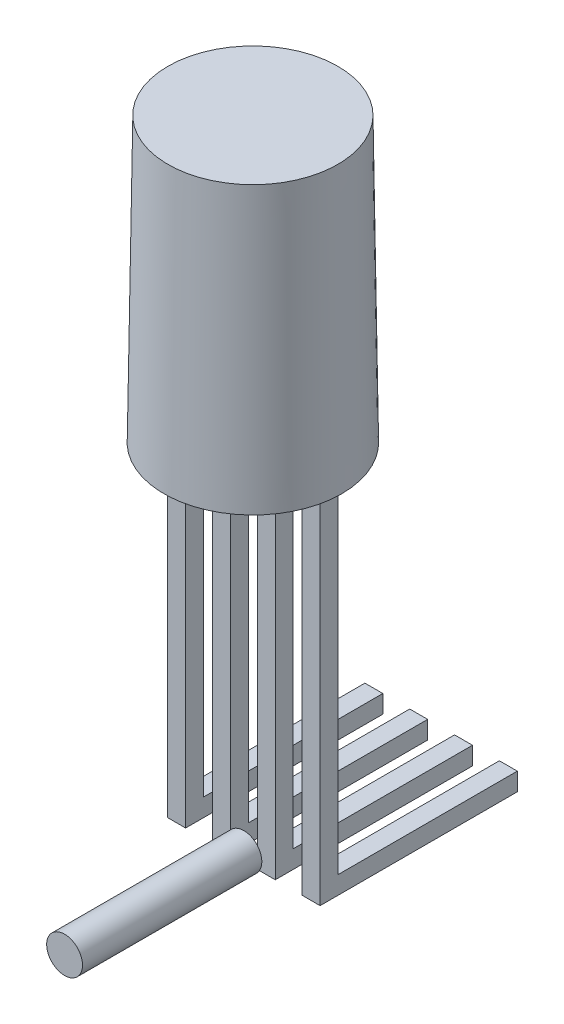
ISO-10303-21;
HEADER;
FILE_DESCRIPTION(('STEP AP214'),'2;1');
FILE_NAME('part.step','',(''),(''),'','','');
FILE_SCHEMA(('AUTOMOTIVE_DESIGN { 1 0 10303 214 1 1 1 1 }'));
ENDSEC;
DATA;
#1=APPLICATION_CONTEXT('core data for automotive mechanical design processes');
#2=APPLICATION_PROTOCOL_DEFINITION('international standard','automotive_design',2000,#1);
#3=PRODUCT_CONTEXT('',#1,'mechanical');
#4=PRODUCT('Part','Part','',(#3));
#5=PRODUCT_RELATED_PRODUCT_CATEGORY('part','',(#4));
#6=PRODUCT_DEFINITION_FORMATION('','',#4);
#7=PRODUCT_DEFINITION_CONTEXT('part definition',#1,'design');
#8=PRODUCT_DEFINITION('design','',#6,#7);
#9=PRODUCT_DEFINITION_SHAPE('','',#8);
#10=(LENGTH_UNIT() NAMED_UNIT(*) SI_UNIT(.MILLI.,.METRE.));
#11=(NAMED_UNIT(*) PLANE_ANGLE_UNIT() SI_UNIT($,.RADIAN.));
#12=(NAMED_UNIT(*) SI_UNIT($,.STERADIAN.) SOLID_ANGLE_UNIT());
#13=UNCERTAINTY_MEASURE_WITH_UNIT(LENGTH_MEASURE(1.E-05),#10,'distance_accuracy_value','');
#14=(GEOMETRIC_REPRESENTATION_CONTEXT(3) GLOBAL_UNCERTAINTY_ASSIGNED_CONTEXT((#13)) GLOBAL_UNIT_ASSIGNED_CONTEXT((#10,
#11,#12)) REPRESENTATION_CONTEXT('',''));
#15=CARTESIAN_POINT('',(0.,0.,0.));
#16=DIRECTION('',(0.,0.,1.));
#17=DIRECTION('',(1.,0.,0.));
#18=AXIS2_PLACEMENT_3D('',#15,#16,#17);
#19=CARTESIAN_POINT('',(0.,0.,0.));
#20=DIRECTION('',(0.,1.,0.));
#21=DIRECTION('',(-1.,0.,0.));
#22=AXIS2_PLACEMENT_3D('',#19,#20,#21);
#23=PLANE('',#22);
#24=DIRECTION('',(-1.,0.,0.));
#25=VECTOR('',#24,1.);
#26=CARTESIAN_POINT('',(0.375,0.,0.25));
#27=LINE('',#26,#25);
#28=CARTESIAN_POINT('',(0.875,0.,0.25));
#29=VERTEX_POINT('',#28);
#30=CARTESIAN_POINT('',(0.375,0.,0.25));
#31=VERTEX_POINT('',#30);
#32=EDGE_CURVE('E237',#29,#31,#27,.T.);
#33=ORIENTED_EDGE('',*,*,#32,.F.);
#34=DIRECTION('',(0.,0.,1.));
#35=VECTOR('',#34,1.);
#36=CARTESIAN_POINT('',(0.875,0.,-0.25));
#37=LINE('',#36,#35);
#38=CARTESIAN_POINT('',(0.875,0.,-0.25));
#39=VERTEX_POINT('',#38);
#40=EDGE_CURVE('E408',#39,#29,#37,.T.);
#41=ORIENTED_EDGE('',*,*,#40,.F.);
#42=DIRECTION('',(1.,0.,0.));
#43=VECTOR('',#42,1.);
#44=CARTESIAN_POINT('',(0.375,0.,-0.25));
#45=LINE('',#44,#43);
#46=CARTESIAN_POINT('',(0.375,0.,-0.25));
#47=VERTEX_POINT('',#46);
#48=EDGE_CURVE('E404',#47,#39,#45,.T.);
#49=ORIENTED_EDGE('',*,*,#48,.F.);
#50=DIRECTION('',(0.,0.,-1.));
#51=VECTOR('',#50,1.);
#52=CARTESIAN_POINT('',(0.375,0.,-0.25));
#53=LINE('',#52,#51);
#54=EDGE_CURVE('E401',#31,#47,#53,.T.);
#55=ORIENTED_EDGE('',*,*,#54,.F.);
#56=EDGE_LOOP('',(#33,#41,#49,#55));
#57=FACE_BOUND('',#56,.T.);
#58=DIRECTION('',(0.,0.,1.));
#59=VECTOR('',#58,1.);
#60=CARTESIAN_POINT('',(-1.625,0.,-0.25));
#61=LINE('',#60,#59);
#62=CARTESIAN_POINT('',(-1.625,0.,-0.25));
#63=VERTEX_POINT('',#62);
#64=CARTESIAN_POINT('',(-1.625,0.,0.25));
#65=VERTEX_POINT('',#64);
#66=EDGE_CURVE('E293',#63,#65,#61,.T.);
#67=ORIENTED_EDGE('',*,*,#66,.F.);
#68=DIRECTION('',(1.,0.,0.));
#69=VECTOR('',#68,1.);
#70=CARTESIAN_POINT('',(-2.125,0.,-0.25));
#71=LINE('',#70,#69);
#72=CARTESIAN_POINT('',(-2.125,0.,-0.25));
#73=VERTEX_POINT('',#72);
#74=EDGE_CURVE('E299',#73,#63,#71,.T.);
#75=ORIENTED_EDGE('',*,*,#74,.F.);
#76=DIRECTION('',(0.,0.,-1.));
#77=VECTOR('',#76,1.);
#78=CARTESIAN_POINT('',(-2.125,0.,-0.25));
#79=LINE('',#78,#77);
#80=CARTESIAN_POINT('',(-2.125,0.,0.25));
#81=VERTEX_POINT('',#80);
#82=EDGE_CURVE('E313',#81,#73,#79,.T.);
#83=ORIENTED_EDGE('',*,*,#82,.F.);
#84=DIRECTION('',(-1.,0.,0.));
#85=VECTOR('',#84,1.);
#86=CARTESIAN_POINT('',(-2.125,0.,0.25));
#87=LINE('',#86,#85);
#88=EDGE_CURVE('E309',#65,#81,#87,.T.);
#89=ORIENTED_EDGE('',*,*,#88,.F.);
#90=EDGE_LOOP('',(#67,#75,#83,#89));
#91=FACE_BOUND('',#90,.T.);
#92=CARTESIAN_POINT('',(0.,0.,0.));
#93=DIRECTION('',(0.,1.,0.));
#94=DIRECTION('',(-1.,0.,0.));
#95=AXIS2_PLACEMENT_3D('',#92,#93,#94);
#96=CIRCLE('',#95,2.48);
#97=CARTESIAN_POINT('',(-2.48,0.,0.));
#98=VERTEX_POINT('',#97);
#99=EDGE_CURVE('E11',#98,#98,#96,.T.);
#100=ORIENTED_EDGE('',*,*,#99,.F.);
#101=EDGE_LOOP('',(#100));
#102=FACE_BOUND('',#101,.T.);
#103=DIRECTION('',(-1.,0.,0.));
#104=VECTOR('',#103,1.);
#105=CARTESIAN_POINT('',(-0.875,0.,0.25));
#106=LINE('',#105,#104);
#107=CARTESIAN_POINT('',(-0.375,0.,0.25));
#108=VERTEX_POINT('',#107);
#109=CARTESIAN_POINT('',(-0.875,0.,0.25));
#110=VERTEX_POINT('',#109);
#111=EDGE_CURVE('E249',#108,#110,#106,.T.);
#112=ORIENTED_EDGE('',*,*,#111,.F.);
#113=DIRECTION('',(0.,0.,1.));
#114=VECTOR('',#113,1.);
#115=CARTESIAN_POINT('',(-0.375,0.,-0.25));
#116=LINE('',#115,#114);
#117=CARTESIAN_POINT('',(-0.375,0.,-0.25));
#118=VERTEX_POINT('',#117);
#119=EDGE_CURVE('E277',#118,#108,#116,.T.);
#120=ORIENTED_EDGE('',*,*,#119,.F.);
#121=DIRECTION('',(1.,0.,0.));
#122=VECTOR('',#121,1.);
#123=CARTESIAN_POINT('',(-0.875,0.,-0.25));
#124=LINE('',#123,#122);
#125=CARTESIAN_POINT('',(-0.875,0.,-0.25));
#126=VERTEX_POINT('',#125);
#127=EDGE_CURVE('E273',#126,#118,#124,.T.);
#128=ORIENTED_EDGE('',*,*,#127,.F.);
#129=DIRECTION('',(0.,0.,-1.));
#130=VECTOR('',#129,1.);
#131=CARTESIAN_POINT('',(-0.875,0.,-0.25));
#132=LINE('',#131,#130);
#133=EDGE_CURVE('E252',#110,#126,#132,.T.);
#134=ORIENTED_EDGE('',*,*,#133,.F.);
#135=EDGE_LOOP('',(#112,#120,#128,#134));
#136=FACE_BOUND('',#135,.T.);
#137=DIRECTION('',(-1.,0.,0.));
#138=VECTOR('',#137,1.);
#139=CARTESIAN_POINT('',(1.625,0.,0.25));
#140=LINE('',#139,#138);
#141=CARTESIAN_POINT('',(2.125,0.,0.25));
#142=VERTEX_POINT('',#141);
#143=CARTESIAN_POINT('',(1.625,0.,0.25));
#144=VERTEX_POINT('',#143);
#145=EDGE_CURVE('E350',#142,#144,#140,.T.);
#146=ORIENTED_EDGE('',*,*,#145,.F.);
#147=DIRECTION('',(0.,0.,1.));
#148=VECTOR('',#147,1.);
#149=CARTESIAN_POINT('',(2.125,0.,-0.25));
#150=LINE('',#149,#148);
#151=CARTESIAN_POINT('',(2.125,0.,-0.25));
#152=VERTEX_POINT('',#151);
#153=EDGE_CURVE('E352',#152,#142,#150,.T.);
#154=ORIENTED_EDGE('',*,*,#153,.F.);
#155=DIRECTION('',(1.,0.,0.));
#156=VECTOR('',#155,1.);
#157=CARTESIAN_POINT('',(1.625,0.,-0.25));
#158=LINE('',#157,#156);
#159=CARTESIAN_POINT('',(1.625,0.,-0.25));
#160=VERTEX_POINT('',#159);
#161=EDGE_CURVE('E369',#160,#152,#158,.T.);
#162=ORIENTED_EDGE('',*,*,#161,.F.);
#163=DIRECTION('',(0.,0.,-1.));
#164=VECTOR('',#163,1.);
#165=CARTESIAN_POINT('',(1.625,0.,-0.25));
#166=LINE('',#165,#164);
#167=EDGE_CURVE('E62',#144,#160,#166,.T.);
#168=ORIENTED_EDGE('',*,*,#167,.F.);
#169=EDGE_LOOP('',(#146,#154,#162,#168));
#170=FACE_BOUND('',#169,.T.);
#171=ADVANCED_FACE('F39',(#57,#91,#102,#136,#170),#23,.F.);
#172=CARTESIAN_POINT('',(0.,0.,0.));
#173=DIRECTION('',(0.,-1.,0.));
#174=DIRECTION('',(1.,0.,0.));
#175=AXIS2_PLACEMENT_3D('',#172,#173,#174);
#176=CONICAL_SURFACE('',#175,2.48,0.0139231508763745);
#177=CARTESIAN_POINT('',(0.,7.9,0.));
#178=DIRECTION('',(0.,1.,0.));
#179=DIRECTION('',(-1.,0.,0.));
#180=AXIS2_PLACEMENT_3D('',#177,#178,#179);
#181=CIRCLE('',#180,2.37);
#182=CARTESIAN_POINT('',(-2.37,7.9,0.));
#183=VERTEX_POINT('',#182);
#184=EDGE_CURVE('E47',#183,#183,#181,.T.);
#185=ORIENTED_EDGE('',*,*,#184,.F.);
#186=EDGE_LOOP('',(#185));
#187=FACE_BOUND('',#186,.T.);
#188=ORIENTED_EDGE('',*,*,#99,.T.);
#189=EDGE_LOOP('',(#188));
#190=FACE_BOUND('',#189,.T.);
#191=ADVANCED_FACE('F338',(#187,#190),#176,.T.);
#192=CARTESIAN_POINT('',(2.37,7.9,0.));
#193=DIRECTION('',(0.,-1.,0.));
#194=DIRECTION('',(1.,0.,0.));
#195=AXIS2_PLACEMENT_3D('',#192,#193,#194);
#196=PLANE('',#195);
#197=ORIENTED_EDGE('',*,*,#184,.T.);
#198=EDGE_LOOP('',(#197));
#199=FACE_BOUND('',#198,.T.);
#200=ADVANCED_FACE('F336',(#199),#196,.F.);
#201=CARTESIAN_POINT('',(-1.625,-10.,-0.25));
#202=DIRECTION('',(-1.,0.,0.));
#203=DIRECTION('',(0.,-1.,0.));
#204=AXIS2_PLACEMENT_3D('',#201,#202,#203);
#205=PLANE('',#204);
#206=ORIENTED_EDGE('',*,*,#66,.T.);
#207=DIRECTION('',(0.,1.,0.));
#208=VECTOR('',#207,1.);
#209=CARTESIAN_POINT('',(-1.625,-10.,0.25));
#210=LINE('',#209,#208);
#211=CARTESIAN_POINT('',(-1.625,-10.,0.25));
#212=VERTEX_POINT('',#211);
#213=EDGE_CURVE('E329',#212,#65,#210,.T.);
#214=ORIENTED_EDGE('',*,*,#213,.F.);
#215=DIRECTION('',(0.,0.,1.));
#216=VECTOR('',#215,1.);
#217=CARTESIAN_POINT('',(-1.625,-10.,-0.25));
#218=LINE('',#217,#216);
#219=CARTESIAN_POINT('',(-1.625,-10.,-5.25));
#220=VERTEX_POINT('',#219);
#221=EDGE_CURVE('E294',#220,#212,#218,.T.);
#222=ORIENTED_EDGE('',*,*,#221,.F.);
#223=DIRECTION('',(0.,1.,0.));
#224=VECTOR('',#223,1.);
#225=CARTESIAN_POINT('',(-1.625,-10.,-5.25));
#226=LINE('',#225,#224);
#227=CARTESIAN_POINT('',(-1.625,-9.5,-5.25));
#228=VERTEX_POINT('',#227);
#229=EDGE_CURVE('E498',#220,#228,#226,.T.);
#230=ORIENTED_EDGE('',*,*,#229,.T.);
#231=DIRECTION('',(0.,0.,1.));
#232=VECTOR('',#231,1.);
#233=CARTESIAN_POINT('',(-1.625,-9.5,-5.25));
#234=LINE('',#233,#232);
#235=CARTESIAN_POINT('',(-1.625,-9.5,-0.25));
#236=VERTEX_POINT('',#235);
#237=EDGE_CURVE('E506',#228,#236,#234,.T.);
#238=ORIENTED_EDGE('',*,*,#237,.T.);
#239=DIRECTION('',(0.,1.,0.));
#240=VECTOR('',#239,1.);
#241=CARTESIAN_POINT('',(-1.625,-10.,-0.25));
#242=LINE('',#241,#240);
#243=EDGE_CURVE('E305',#236,#63,#242,.T.);
#244=ORIENTED_EDGE('',*,*,#243,.T.);
#245=EDGE_LOOP('',(#206,#214,#222,#230,#238,#244));
#246=FACE_BOUND('',#245,.T.);
#247=ADVANCED_FACE('F645',(#246),#205,.F.);
#248=CARTESIAN_POINT('',(-2.125,-10.,0.25));
#249=DIRECTION('',(0.,0.,-1.));
#250=DIRECTION('',(-1.,0.,0.));
#251=AXIS2_PLACEMENT_3D('',#248,#249,#250);
#252=PLANE('',#251);
#253=ORIENTED_EDGE('',*,*,#88,.T.);
#254=DIRECTION('',(0.,1.,0.));
#255=VECTOR('',#254,1.);
#256=CARTESIAN_POINT('',(-2.125,-10.,0.25));
#257=LINE('',#256,#255);
#258=CARTESIAN_POINT('',(-2.125,-10.,0.25));
#259=VERTEX_POINT('',#258);
#260=EDGE_CURVE('E325',#259,#81,#257,.T.);
#261=ORIENTED_EDGE('',*,*,#260,.F.);
#262=DIRECTION('',(-1.,0.,0.));
#263=VECTOR('',#262,1.);
#264=CARTESIAN_POINT('',(-2.125,-10.,0.25));
#265=LINE('',#264,#263);
#266=EDGE_CURVE('E298',#212,#259,#265,.T.);
#267=ORIENTED_EDGE('',*,*,#266,.F.);
#268=ORIENTED_EDGE('',*,*,#213,.T.);
#269=EDGE_LOOP('',(#253,#261,#267,#268));
#270=FACE_BOUND('',#269,.T.);
#271=ADVANCED_FACE('F641',(#270),#252,.F.);
#272=CARTESIAN_POINT('',(-2.125,-10.,-0.25));
#273=DIRECTION('',(1.,0.,0.));
#274=DIRECTION('',(0.,1.,0.));
#275=AXIS2_PLACEMENT_3D('',#272,#273,#274);
#276=PLANE('',#275);
#277=ORIENTED_EDGE('',*,*,#82,.T.);
#278=DIRECTION('',(0.,1.,0.));
#279=VECTOR('',#278,1.);
#280=CARTESIAN_POINT('',(-2.125,-10.,-0.25));
#281=LINE('',#280,#279);
#282=CARTESIAN_POINT('',(-2.125,-9.5,-0.25));
#283=VERTEX_POINT('',#282);
#284=EDGE_CURVE('E322',#283,#73,#281,.T.);
#285=ORIENTED_EDGE('',*,*,#284,.F.);
#286=DIRECTION('',(0.,0.,1.));
#287=VECTOR('',#286,1.);
#288=CARTESIAN_POINT('',(-2.125,-9.5,-5.25));
#289=LINE('',#288,#287);
#290=CARTESIAN_POINT('',(-2.125,-9.5,-5.25));
#291=VERTEX_POINT('',#290);
#292=EDGE_CURVE('E358',#291,#283,#289,.T.);
#293=ORIENTED_EDGE('',*,*,#292,.F.);
#294=DIRECTION('',(0.,-1.,0.));
#295=VECTOR('',#294,1.);
#296=CARTESIAN_POINT('',(-2.125,-10.,-5.25));
#297=LINE('',#296,#295);
#298=CARTESIAN_POINT('',(-2.125,-10.,-5.25));
#299=VERTEX_POINT('',#298);
#300=EDGE_CURVE('E490',#291,#299,#297,.T.);
#301=ORIENTED_EDGE('',*,*,#300,.T.);
#302=DIRECTION('',(0.,0.,-1.));
#303=VECTOR('',#302,1.);
#304=CARTESIAN_POINT('',(-2.125,-10.,-0.25));
#305=LINE('',#304,#303);
#306=EDGE_CURVE('E302',#259,#299,#305,.T.);
#307=ORIENTED_EDGE('',*,*,#306,.F.);
#308=ORIENTED_EDGE('',*,*,#260,.T.);
#309=EDGE_LOOP('',(#277,#285,#293,#301,#307,#308));
#310=FACE_BOUND('',#309,.T.);
#311=ADVANCED_FACE('F637',(#310),#276,.F.);
#312=CARTESIAN_POINT('',(-2.125,-10.,-0.25));
#313=DIRECTION('',(0.,0.,1.));
#314=DIRECTION('',(1.,0.,0.));
#315=AXIS2_PLACEMENT_3D('',#312,#313,#314);
#316=PLANE('',#315);
#317=ORIENTED_EDGE('',*,*,#243,.F.);
#318=DIRECTION('',(-1.,0.,0.));
#319=VECTOR('',#318,1.);
#320=CARTESIAN_POINT('',(-2.125,-9.5,-0.25));
#321=LINE('',#320,#319);
#322=EDGE_CURVE('E487',#236,#283,#321,.T.);
#323=ORIENTED_EDGE('',*,*,#322,.T.);
#324=ORIENTED_EDGE('',*,*,#284,.T.);
#325=ORIENTED_EDGE('',*,*,#74,.T.);
#326=EDGE_LOOP('',(#317,#323,#324,#325));
#327=FACE_BOUND('',#326,.T.);
#328=ADVANCED_FACE('F633',(#327),#316,.F.);
#329=CARTESIAN_POINT('',(0.,-10.,0.));
#330=DIRECTION('',(0.,1.,0.));
#331=DIRECTION('',(-1.,0.,0.));
#332=AXIS2_PLACEMENT_3D('',#329,#330,#331);
#333=PLANE('',#332);
#334=ORIENTED_EDGE('',*,*,#221,.T.);
#335=ORIENTED_EDGE('',*,*,#266,.T.);
#336=ORIENTED_EDGE('',*,*,#306,.T.);
#337=DIRECTION('',(1.,0.,0.));
#338=VECTOR('',#337,1.);
#339=CARTESIAN_POINT('',(-2.125,-10.,-5.25));
#340=LINE('',#339,#338);
#341=EDGE_CURVE('E494',#299,#220,#340,.T.);
#342=ORIENTED_EDGE('',*,*,#341,.T.);
#343=EDGE_LOOP('',(#334,#335,#336,#342));
#344=FACE_BOUND('',#343,.T.);
#345=ADVANCED_FACE('F629',(#344),#333,.F.);
#346=CARTESIAN_POINT('',(-0.875,-10.,0.25));
#347=DIRECTION('',(0.,0.,-1.));
#348=DIRECTION('',(-1.,0.,0.));
#349=AXIS2_PLACEMENT_3D('',#346,#347,#348);
#350=PLANE('',#349);
#351=CARTESIAN_POINT('',(0.,-9.75,0.25));
#352=DIRECTION('',(0.,0.,1.));
#353=DIRECTION('',(1.,0.,0.));
#354=AXIS2_PLACEMENT_3D('',#351,#352,#353);
#355=CIRCLE('',#354,0.5);
#356=CARTESIAN_POINT('',(-0.375,-9.41928108611693,0.25));
#357=VERTEX_POINT('',#356);
#358=CARTESIAN_POINT('',(-0.433012701892219,-10.,0.25));
#359=VERTEX_POINT('',#358);
#360=EDGE_CURVE('E54',#357,#359,#355,.T.);
#361=ORIENTED_EDGE('',*,*,#360,.F.);
#362=DIRECTION('',(0.,1.,0.));
#363=VECTOR('',#362,1.);
#364=CARTESIAN_POINT('',(-0.375,-10.,0.25));
#365=LINE('',#364,#363);
#366=EDGE_CURVE('E268',#357,#108,#365,.T.);
#367=ORIENTED_EDGE('',*,*,#366,.T.);
#368=ORIENTED_EDGE('',*,*,#111,.T.);
#369=DIRECTION('',(0.,1.,0.));
#370=VECTOR('',#369,1.);
#371=CARTESIAN_POINT('',(-0.875,-10.,0.25));
#372=LINE('',#371,#370);
#373=CARTESIAN_POINT('',(-0.875,-10.,0.25));
#374=VERTEX_POINT('',#373);
#375=EDGE_CURVE('E289',#374,#110,#372,.T.);
#376=ORIENTED_EDGE('',*,*,#375,.F.);
#377=DIRECTION('',(-1.,0.,0.));
#378=VECTOR('',#377,1.);
#379=CARTESIAN_POINT('',(-0.875,-10.,0.25));
#380=LINE('',#379,#378);
#381=EDGE_CURVE('E262',#359,#374,#380,.T.);
#382=ORIENTED_EDGE('',*,*,#381,.F.);
#383=EDGE_LOOP('',(#361,#367,#368,#376,#382));
#384=FACE_BOUND('',#383,.T.);
#385=ADVANCED_FACE('F625',(#384),#350,.F.);
#386=CARTESIAN_POINT('',(-0.875,-10.,-0.25));
#387=DIRECTION('',(1.,0.,0.));
#388=DIRECTION('',(0.,0.,-1.));
#389=AXIS2_PLACEMENT_3D('',#386,#387,#388);
#390=PLANE('',#389);
#391=ORIENTED_EDGE('',*,*,#133,.T.);
#392=DIRECTION('',(0.,1.,0.));
#393=VECTOR('',#392,1.);
#394=CARTESIAN_POINT('',(-0.875,-10.,-0.25));
#395=LINE('',#394,#393);
#396=CARTESIAN_POINT('',(-0.875,-9.5,-0.25));
#397=VERTEX_POINT('',#396);
#398=EDGE_CURVE('E286',#397,#126,#395,.T.);
#399=ORIENTED_EDGE('',*,*,#398,.F.);
#400=DIRECTION('',(0.,0.,1.));
#401=VECTOR('',#400,1.);
#402=CARTESIAN_POINT('',(-0.875,-9.5,-5.25));
#403=LINE('',#402,#401);
#404=CARTESIAN_POINT('',(-0.875,-9.5,-5.25));
#405=VERTEX_POINT('',#404);
#406=EDGE_CURVE('E484',#405,#397,#403,.T.);
#407=ORIENTED_EDGE('',*,*,#406,.F.);
#408=DIRECTION('',(0.,-1.,0.));
#409=VECTOR('',#408,1.);
#410=CARTESIAN_POINT('',(-0.875,-10.,-5.25));
#411=LINE('',#410,#409);
#412=CARTESIAN_POINT('',(-0.875,-10.,-5.25));
#413=VERTEX_POINT('',#412);
#414=EDGE_CURVE('E476',#405,#413,#411,.T.);
#415=ORIENTED_EDGE('',*,*,#414,.T.);
#416=DIRECTION('',(0.,0.,-1.));
#417=VECTOR('',#416,1.);
#418=CARTESIAN_POINT('',(-0.875,-10.,-0.25));
#419=LINE('',#418,#417);
#420=EDGE_CURVE('E261',#374,#413,#419,.T.);
#421=ORIENTED_EDGE('',*,*,#420,.F.);
#422=ORIENTED_EDGE('',*,*,#375,.T.);
#423=EDGE_LOOP('',(#391,#399,#407,#415,#421,#422));
#424=FACE_BOUND('',#423,.T.);
#425=ADVANCED_FACE('F621',(#424),#390,.F.);
#426=CARTESIAN_POINT('',(-0.875,-10.,-0.25));
#427=DIRECTION('',(0.,0.,1.));
#428=DIRECTION('',(1.,0.,0.));
#429=AXIS2_PLACEMENT_3D('',#426,#427,#428);
#430=PLANE('',#429);
#431=DIRECTION('',(0.,1.,0.));
#432=VECTOR('',#431,1.);
#433=CARTESIAN_POINT('',(-0.375,-10.,-0.25));
#434=LINE('',#433,#432);
#435=CARTESIAN_POINT('',(-0.375,-9.5,-0.25));
#436=VERTEX_POINT('',#435);
#437=EDGE_CURVE('E283',#436,#118,#434,.T.);
#438=ORIENTED_EDGE('',*,*,#437,.F.);
#439=DIRECTION('',(-1.,0.,0.));
#440=VECTOR('',#439,1.);
#441=CARTESIAN_POINT('',(-0.875,-9.5,-0.25));
#442=LINE('',#441,#440);
#443=EDGE_CURVE('E461',#436,#397,#442,.T.);
#444=ORIENTED_EDGE('',*,*,#443,.T.);
#445=ORIENTED_EDGE('',*,*,#398,.T.);
#446=ORIENTED_EDGE('',*,*,#127,.T.);
#447=EDGE_LOOP('',(#438,#444,#445,#446));
#448=FACE_BOUND('',#447,.T.);
#449=ADVANCED_FACE('F617',(#448),#430,.F.);
#450=CARTESIAN_POINT('',(-0.375,-10.,-0.25));
#451=DIRECTION('',(-1.,0.,0.));
#452=DIRECTION('',(0.,0.,1.));
#453=AXIS2_PLACEMENT_3D('',#450,#451,#452);
#454=PLANE('',#453);
#455=ORIENTED_EDGE('',*,*,#119,.T.);
#456=ORIENTED_EDGE('',*,*,#366,.F.);
#457=CARTESIAN_POINT('',(-0.375,-10.,0.25));
#458=VERTEX_POINT('',#457);
#459=EDGE_CURVE('E230',#458,#357,#365,.T.);
#460=ORIENTED_EDGE('',*,*,#459,.F.);
#461=DIRECTION('',(0.,0.,1.));
#462=VECTOR('',#461,1.);
#463=CARTESIAN_POINT('',(-0.375,-10.,-0.25));
#464=LINE('',#463,#462);
#465=CARTESIAN_POINT('',(-0.375,-10.,-5.25));
#466=VERTEX_POINT('',#465);
#467=EDGE_CURVE('E265',#466,#458,#464,.T.);
#468=ORIENTED_EDGE('',*,*,#467,.F.);
#469=DIRECTION('',(0.,1.,0.));
#470=VECTOR('',#469,1.);
#471=CARTESIAN_POINT('',(-0.375,-10.,-5.25));
#472=LINE('',#471,#470);
#473=CARTESIAN_POINT('',(-0.375,-9.5,-5.25));
#474=VERTEX_POINT('',#473);
#475=EDGE_CURVE('E468',#466,#474,#472,.T.);
#476=ORIENTED_EDGE('',*,*,#475,.T.);
#477=DIRECTION('',(0.,0.,1.));
#478=VECTOR('',#477,1.);
#479=CARTESIAN_POINT('',(-0.375,-9.5,-5.25));
#480=LINE('',#479,#478);
#481=EDGE_CURVE('E480',#474,#436,#480,.T.);
#482=ORIENTED_EDGE('',*,*,#481,.T.);
#483=ORIENTED_EDGE('',*,*,#437,.T.);
#484=EDGE_LOOP('',(#455,#456,#460,#468,#476,#482,#483));
#485=FACE_BOUND('',#484,.T.);
#486=ADVANCED_FACE('F613',(#485),#454,.F.);
#487=CARTESIAN_POINT('',(0.,-10.,0.));
#488=DIRECTION('',(0.,-1.,0.));
#489=DIRECTION('',(1.,0.,0.));
#490=AXIS2_PLACEMENT_3D('',#487,#488,#489);
#491=PLANE('',#490);
#492=EDGE_CURVE('E257',#458,#359,#380,.T.);
#493=ORIENTED_EDGE('',*,*,#492,.T.);
#494=ORIENTED_EDGE('',*,*,#381,.T.);
#495=ORIENTED_EDGE('',*,*,#420,.T.);
#496=DIRECTION('',(1.,0.,0.));
#497=VECTOR('',#496,1.);
#498=CARTESIAN_POINT('',(-0.875,-10.,-5.25));
#499=LINE('',#498,#497);
#500=EDGE_CURVE('E464',#413,#466,#499,.T.);
#501=ORIENTED_EDGE('',*,*,#500,.T.);
#502=ORIENTED_EDGE('',*,*,#467,.T.);
#503=EDGE_LOOP('',(#493,#494,#495,#501,#502));
#504=FACE_BOUND('',#503,.T.);
#505=ADVANCED_FACE('F610',(#504),#491,.T.);
#506=CARTESIAN_POINT('',(0.375,-10.,0.25));
#507=DIRECTION('',(0.,0.,-1.));
#508=DIRECTION('',(-1.,0.,0.));
#509=AXIS2_PLACEMENT_3D('',#506,#507,#508);
#510=PLANE('',#509);
#511=CARTESIAN_POINT('',(0.43301270189222,-10.,0.25));
#512=VERTEX_POINT('',#511);
#513=CARTESIAN_POINT('',(0.375,-9.41928108611693,0.25));
#514=VERTEX_POINT('',#513);
#515=EDGE_CURVE('E213',#512,#514,#355,.T.);
#516=ORIENTED_EDGE('',*,*,#515,.F.);
#517=DIRECTION('',(-1.,0.,0.));
#518=VECTOR('',#517,1.);
#519=CARTESIAN_POINT('',(0.375,-10.,0.25));
#520=LINE('',#519,#518);
#521=CARTESIAN_POINT('',(0.875,-10.,0.25));
#522=VERTEX_POINT('',#521);
#523=EDGE_CURVE('E389',#522,#512,#520,.T.);
#524=ORIENTED_EDGE('',*,*,#523,.F.);
#525=DIRECTION('',(0.,1.,0.));
#526=VECTOR('',#525,1.);
#527=CARTESIAN_POINT('',(0.875,-10.,0.25));
#528=LINE('',#527,#526);
#529=EDGE_CURVE('E398',#522,#29,#528,.T.);
#530=ORIENTED_EDGE('',*,*,#529,.T.);
#531=ORIENTED_EDGE('',*,*,#32,.T.);
#532=DIRECTION('',(0.,1.,0.));
#533=VECTOR('',#532,1.);
#534=CARTESIAN_POINT('',(0.375,-10.,0.25));
#535=LINE('',#534,#533);
#536=EDGE_CURVE('E234',#514,#31,#535,.T.);
#537=ORIENTED_EDGE('',*,*,#536,.F.);
#538=EDGE_LOOP('',(#516,#524,#530,#531,#537));
#539=FACE_BOUND('',#538,.T.);
#540=ADVANCED_FACE('F235',(#539),#510,.F.);
#541=CARTESIAN_POINT('',(0.375,-10.,-0.25));
#542=DIRECTION('',(1.,0.,0.));
#543=DIRECTION('',(0.,1.,0.));
#544=AXIS2_PLACEMENT_3D('',#541,#542,#543);
#545=PLANE('',#544);
#546=ORIENTED_EDGE('',*,*,#54,.T.);
#547=DIRECTION('',(0.,1.,0.));
#548=VECTOR('',#547,1.);
#549=CARTESIAN_POINT('',(0.375,-10.,-0.25));
#550=LINE('',#549,#548);
#551=CARTESIAN_POINT('',(0.375,-9.5,-0.25));
#552=VERTEX_POINT('',#551);
#553=EDGE_CURVE('E242',#552,#47,#550,.T.);
#554=ORIENTED_EDGE('',*,*,#553,.F.);
#555=DIRECTION('',(0.,0.,1.));
#556=VECTOR('',#555,1.);
#557=CARTESIAN_POINT('',(0.375,-9.5,-5.25));
#558=LINE('',#557,#556);
#559=CARTESIAN_POINT('',(0.375,-9.5,-5.25));
#560=VERTEX_POINT('',#559);
#561=EDGE_CURVE('E458',#560,#552,#558,.T.);
#562=ORIENTED_EDGE('',*,*,#561,.F.);
#563=DIRECTION('',(0.,-1.,0.));
#564=VECTOR('',#563,1.);
#565=CARTESIAN_POINT('',(0.375,-10.,-5.25));
#566=LINE('',#565,#564);
#567=CARTESIAN_POINT('',(0.375,-10.,-5.25));
#568=VERTEX_POINT('',#567);
#569=EDGE_CURVE('E447',#560,#568,#566,.T.);
#570=ORIENTED_EDGE('',*,*,#569,.T.);
#571=DIRECTION('',(0.,0.,-1.));
#572=VECTOR('',#571,1.);
#573=CARTESIAN_POINT('',(0.375,-10.,-0.25));
#574=LINE('',#573,#572);
#575=CARTESIAN_POINT('',(0.375,-10.,0.25));
#576=VERTEX_POINT('',#575);
#577=EDGE_CURVE('E247',#576,#568,#574,.T.);
#578=ORIENTED_EDGE('',*,*,#577,.F.);
#579=EDGE_CURVE('E227',#576,#514,#535,.T.);
#580=ORIENTED_EDGE('',*,*,#579,.T.);
#581=ORIENTED_EDGE('',*,*,#536,.T.);
#582=EDGE_LOOP('',(#546,#554,#562,#570,#578,#580,#581));
#583=FACE_BOUND('',#582,.T.);
#584=ADVANCED_FACE('F245',(#583),#545,.F.);
#585=CARTESIAN_POINT('',(0.375,-10.,-0.25));
#586=DIRECTION('',(0.,0.,1.));
#587=DIRECTION('',(1.,0.,0.));
#588=AXIS2_PLACEMENT_3D('',#585,#586,#587);
#589=PLANE('',#588);
#590=DIRECTION('',(0.,1.,0.));
#591=VECTOR('',#590,1.);
#592=CARTESIAN_POINT('',(0.875,-10.,-0.25));
#593=LINE('',#592,#591);
#594=CARTESIAN_POINT('',(0.875,-9.5,-0.25));
#595=VERTEX_POINT('',#594);
#596=EDGE_CURVE('E413',#595,#39,#593,.T.);
#597=ORIENTED_EDGE('',*,*,#596,.F.);
#598=DIRECTION('',(-1.,0.,0.));
#599=VECTOR('',#598,1.);
#600=CARTESIAN_POINT('',(0.375,-9.5,-0.25));
#601=LINE('',#600,#599);
#602=EDGE_CURVE('E425',#595,#552,#601,.T.);
#603=ORIENTED_EDGE('',*,*,#602,.T.);
#604=ORIENTED_EDGE('',*,*,#553,.T.);
#605=ORIENTED_EDGE('',*,*,#48,.T.);
#606=EDGE_LOOP('',(#597,#603,#604,#605));
#607=FACE_BOUND('',#606,.T.);
#608=ADVANCED_FACE('F423',(#607),#589,.F.);
#609=CARTESIAN_POINT('',(0.875,-10.,-0.25));
#610=DIRECTION('',(-1.,0.,0.));
#611=DIRECTION('',(0.,-1.,0.));
#612=AXIS2_PLACEMENT_3D('',#609,#610,#611);
#613=PLANE('',#612);
#614=ORIENTED_EDGE('',*,*,#40,.T.);
#615=ORIENTED_EDGE('',*,*,#529,.F.);
#616=DIRECTION('',(0.,0.,1.));
#617=VECTOR('',#616,1.);
#618=CARTESIAN_POINT('',(0.875,-10.,-0.25));
#619=LINE('',#618,#617);
#620=CARTESIAN_POINT('',(0.875,-10.,-5.25));
#621=VERTEX_POINT('',#620);
#622=EDGE_CURVE('E395',#621,#522,#619,.T.);
#623=ORIENTED_EDGE('',*,*,#622,.F.);
#624=DIRECTION('',(0.,1.,0.));
#625=VECTOR('',#624,1.);
#626=CARTESIAN_POINT('',(0.875,-10.,-5.25));
#627=LINE('',#626,#625);
#628=CARTESIAN_POINT('',(0.875,-9.5,-5.25));
#629=VERTEX_POINT('',#628);
#630=EDGE_CURVE('E436',#621,#629,#627,.T.);
#631=ORIENTED_EDGE('',*,*,#630,.T.);
#632=DIRECTION('',(0.,0.,1.));
#633=VECTOR('',#632,1.);
#634=CARTESIAN_POINT('',(0.875,-9.5,-5.25));
#635=LINE('',#634,#633);
#636=EDGE_CURVE('E454',#629,#595,#635,.T.);
#637=ORIENTED_EDGE('',*,*,#636,.T.);
#638=ORIENTED_EDGE('',*,*,#596,.T.);
#639=EDGE_LOOP('',(#614,#615,#623,#631,#637,#638));
#640=FACE_BOUND('',#639,.T.);
#641=ADVANCED_FACE('F428',(#640),#613,.F.);
#642=CARTESIAN_POINT('',(0.,-10.,0.));
#643=DIRECTION('',(0.,-1.,0.));
#644=DIRECTION('',(1.,0.,0.));
#645=AXIS2_PLACEMENT_3D('',#642,#643,#644);
#646=PLANE('',#645);
#647=ORIENTED_EDGE('',*,*,#523,.T.);
#648=EDGE_CURVE('E392',#512,#576,#520,.T.);
#649=ORIENTED_EDGE('',*,*,#648,.T.);
#650=ORIENTED_EDGE('',*,*,#577,.T.);
#651=DIRECTION('',(1.,0.,0.));
#652=VECTOR('',#651,1.);
#653=CARTESIAN_POINT('',(0.375,-10.,-5.25));
#654=LINE('',#653,#652);
#655=EDGE_CURVE('E433',#568,#621,#654,.T.);
#656=ORIENTED_EDGE('',*,*,#655,.T.);
#657=ORIENTED_EDGE('',*,*,#622,.T.);
#658=EDGE_LOOP('',(#647,#649,#650,#656,#657));
#659=FACE_BOUND('',#658,.T.);
#660=ADVANCED_FACE('F430',(#659),#646,.T.);
#661=CARTESIAN_POINT('',(1.625,-10.,0.25));
#662=DIRECTION('',(0.,0.,-1.));
#663=DIRECTION('',(-1.,0.,0.));
#664=AXIS2_PLACEMENT_3D('',#661,#662,#663);
#665=PLANE('',#664);
#666=ORIENTED_EDGE('',*,*,#145,.T.);
#667=DIRECTION('',(0.,1.,0.));
#668=VECTOR('',#667,1.);
#669=CARTESIAN_POINT('',(1.625,-10.,0.25));
#670=LINE('',#669,#668);
#671=CARTESIAN_POINT('',(1.625,-10.,0.25));
#672=VERTEX_POINT('',#671);
#673=EDGE_CURVE('E386',#672,#144,#670,.T.);
#674=ORIENTED_EDGE('',*,*,#673,.F.);
#675=DIRECTION('',(-1.,0.,0.));
#676=VECTOR('',#675,1.);
#677=CARTESIAN_POINT('',(1.625,-10.,0.25));
#678=LINE('',#677,#676);
#679=CARTESIAN_POINT('',(2.125,-10.,0.25));
#680=VERTEX_POINT('',#679);
#681=EDGE_CURVE('E368',#680,#672,#678,.T.);
#682=ORIENTED_EDGE('',*,*,#681,.F.);
#683=DIRECTION('',(0.,1.,0.));
#684=VECTOR('',#683,1.);
#685=CARTESIAN_POINT('',(2.125,-10.,0.25));
#686=LINE('',#685,#684);
#687=EDGE_CURVE('E363',#680,#142,#686,.T.);
#688=ORIENTED_EDGE('',*,*,#687,.T.);
#689=EDGE_LOOP('',(#666,#674,#682,#688));
#690=FACE_BOUND('',#689,.T.);
#691=ADVANCED_FACE('F371',(#690),#665,.F.);
#692=CARTESIAN_POINT('',(1.625,-10.,-0.25));
#693=DIRECTION('',(1.,0.,0.));
#694=DIRECTION('',(0.,1.,0.));
#695=AXIS2_PLACEMENT_3D('',#692,#693,#694);
#696=PLANE('',#695);
#697=ORIENTED_EDGE('',*,*,#167,.T.);
#698=DIRECTION('',(0.,1.,0.));
#699=VECTOR('',#698,1.);
#700=CARTESIAN_POINT('',(1.625,-10.,-0.25));
#701=LINE('',#700,#699);
#702=CARTESIAN_POINT('',(1.625,-9.5,-0.25));
#703=VERTEX_POINT('',#702);
#704=EDGE_CURVE('E378',#703,#160,#701,.T.);
#705=ORIENTED_EDGE('',*,*,#704,.F.);
#706=DIRECTION('',(0.,0.,1.));
#707=VECTOR('',#706,1.);
#708=CARTESIAN_POINT('',(1.625,-9.5,-5.25));
#709=LINE('',#708,#707);
#710=CARTESIAN_POINT('',(1.625,-9.5,-5.25));
#711=VERTEX_POINT('',#710);
#712=EDGE_CURVE('E457',#711,#703,#709,.T.);
#713=ORIENTED_EDGE('',*,*,#712,.F.);
#714=DIRECTION('',(0.,-1.,0.));
#715=VECTOR('',#714,1.);
#716=CARTESIAN_POINT('',(1.625,-10.,-5.25));
#717=LINE('',#716,#715);
#718=CARTESIAN_POINT('',(1.625,-10.,-5.25));
#719=VERTEX_POINT('',#718);
#720=EDGE_CURVE('E528',#711,#719,#717,.T.);
#721=ORIENTED_EDGE('',*,*,#720,.T.);
#722=DIRECTION('',(0.,0.,-1.));
#723=VECTOR('',#722,1.);
#724=CARTESIAN_POINT('',(1.625,-10.,-0.25));
#725=LINE('',#724,#723);
#726=EDGE_CURVE('E380',#672,#719,#725,.T.);
#727=ORIENTED_EDGE('',*,*,#726,.F.);
#728=ORIENTED_EDGE('',*,*,#673,.T.);
#729=EDGE_LOOP('',(#697,#705,#713,#721,#727,#728));
#730=FACE_BOUND('',#729,.T.);
#731=ADVANCED_FACE('F525',(#730),#696,.F.);
#732=CARTESIAN_POINT('',(1.625,-10.,-0.25));
#733=DIRECTION('',(0.,0.,1.));
#734=DIRECTION('',(1.,0.,0.));
#735=AXIS2_PLACEMENT_3D('',#732,#733,#734);
#736=PLANE('',#735);
#737=DIRECTION('',(0.,1.,0.));
#738=VECTOR('',#737,1.);
#739=CARTESIAN_POINT('',(2.125,-10.,-0.25));
#740=LINE('',#739,#738);
#741=CARTESIAN_POINT('',(2.125,-9.5,-0.25));
#742=VERTEX_POINT('',#741);
#743=EDGE_CURVE('E366',#742,#152,#740,.T.);
#744=ORIENTED_EDGE('',*,*,#743,.F.);
#745=DIRECTION('',(-1.,0.,0.));
#746=VECTOR('',#745,1.);
#747=CARTESIAN_POINT('',(1.625,-9.5,-0.25));
#748=LINE('',#747,#746);
#749=EDGE_CURVE('E547',#742,#703,#748,.T.);
#750=ORIENTED_EDGE('',*,*,#749,.T.);
#751=ORIENTED_EDGE('',*,*,#704,.T.);
#752=ORIENTED_EDGE('',*,*,#161,.T.);
#753=EDGE_LOOP('',(#744,#750,#751,#752));
#754=FACE_BOUND('',#753,.T.);
#755=ADVANCED_FACE('F521',(#754),#736,.F.);
#756=CARTESIAN_POINT('',(2.125,-10.,-0.25));
#757=DIRECTION('',(-1.,0.,0.));
#758=DIRECTION('',(0.,-1.,0.));
#759=AXIS2_PLACEMENT_3D('',#756,#757,#758);
#760=PLANE('',#759);
#761=ORIENTED_EDGE('',*,*,#153,.T.);
#762=ORIENTED_EDGE('',*,*,#687,.F.);
#763=DIRECTION('',(0.,0.,1.));
#764=VECTOR('',#763,1.);
#765=CARTESIAN_POINT('',(2.125,-10.,-0.25));
#766=LINE('',#765,#764);
#767=CARTESIAN_POINT('',(2.125,-10.,-5.25));
#768=VERTEX_POINT('',#767);
#769=EDGE_CURVE('E374',#768,#680,#766,.T.);
#770=ORIENTED_EDGE('',*,*,#769,.F.);
#771=DIRECTION('',(0.,1.,0.));
#772=VECTOR('',#771,1.);
#773=CARTESIAN_POINT('',(2.125,-10.,-5.25));
#774=LINE('',#773,#772);
#775=CARTESIAN_POINT('',(2.125,-9.5,-5.25));
#776=VERTEX_POINT('',#775);
#777=EDGE_CURVE('E536',#768,#776,#774,.T.);
#778=ORIENTED_EDGE('',*,*,#777,.T.);
#779=DIRECTION('',(0.,0.,1.));
#780=VECTOR('',#779,1.);
#781=CARTESIAN_POINT('',(2.125,-9.5,-5.25));
#782=LINE('',#781,#780);
#783=EDGE_CURVE('E552',#776,#742,#782,.T.);
#784=ORIENTED_EDGE('',*,*,#783,.T.);
#785=ORIENTED_EDGE('',*,*,#743,.T.);
#786=EDGE_LOOP('',(#761,#762,#770,#778,#784,#785));
#787=FACE_BOUND('',#786,.T.);
#788=ADVANCED_FACE('F362',(#787),#760,.F.);
#789=CARTESIAN_POINT('',(0.,-10.,0.));
#790=DIRECTION('',(0.,-1.,0.));
#791=DIRECTION('',(1.,0.,0.));
#792=AXIS2_PLACEMENT_3D('',#789,#790,#791);
#793=PLANE('',#792);
#794=ORIENTED_EDGE('',*,*,#681,.T.);
#795=ORIENTED_EDGE('',*,*,#726,.T.);
#796=DIRECTION('',(1.,0.,0.));
#797=VECTOR('',#796,1.);
#798=CARTESIAN_POINT('',(1.625,-10.,-5.25));
#799=LINE('',#798,#797);
#800=EDGE_CURVE('E533',#719,#768,#799,.T.);
#801=ORIENTED_EDGE('',*,*,#800,.T.);
#802=ORIENTED_EDGE('',*,*,#769,.T.);
#803=EDGE_LOOP('',(#794,#795,#801,#802));
#804=FACE_BOUND('',#803,.T.);
#805=ADVANCED_FACE('F532',(#804),#793,.T.);
#806=CARTESIAN_POINT('',(-2.125,-9.5,-5.25));
#807=DIRECTION('',(0.,1.,0.));
#808=DIRECTION('',(0.,0.,1.));
#809=AXIS2_PLACEMENT_3D('',#806,#807,#808);
#810=PLANE('',#809);
#811=ORIENTED_EDGE('',*,*,#322,.F.);
#812=ORIENTED_EDGE('',*,*,#237,.F.);
#813=DIRECTION('',(-1.,0.,0.));
#814=VECTOR('',#813,1.);
#815=CARTESIAN_POINT('',(-2.125,-9.5,-5.25));
#816=LINE('',#815,#814);
#817=EDGE_CURVE('E502',#228,#291,#816,.T.);
#818=ORIENTED_EDGE('',*,*,#817,.T.);
#819=ORIENTED_EDGE('',*,*,#292,.T.);
#820=EDGE_LOOP('',(#811,#812,#818,#819));
#821=FACE_BOUND('',#820,.T.);
#822=ADVANCED_FACE('F585',(#821),#810,.T.);
#823=CARTESIAN_POINT('',(0.,0.,-5.25));
#824=DIRECTION('',(0.,0.,-1.));
#825=DIRECTION('',(-1.,0.,0.));
#826=AXIS2_PLACEMENT_3D('',#823,#824,#825);
#827=PLANE('',#826);
#828=ORIENTED_EDGE('',*,*,#300,.F.);
#829=ORIENTED_EDGE('',*,*,#817,.F.);
#830=ORIENTED_EDGE('',*,*,#229,.F.);
#831=ORIENTED_EDGE('',*,*,#341,.F.);
#832=EDGE_LOOP('',(#828,#829,#830,#831));
#833=FACE_BOUND('',#832,.T.);
#834=ADVANCED_FACE('F581',(#833),#827,.T.);
#835=CARTESIAN_POINT('',(-0.875,-9.5,-5.25));
#836=DIRECTION('',(0.,1.,0.));
#837=DIRECTION('',(0.,0.,1.));
#838=AXIS2_PLACEMENT_3D('',#835,#836,#837);
#839=PLANE('',#838);
#840=ORIENTED_EDGE('',*,*,#443,.F.);
#841=ORIENTED_EDGE('',*,*,#481,.F.);
#842=DIRECTION('',(-1.,0.,0.));
#843=VECTOR('',#842,1.);
#844=CARTESIAN_POINT('',(-0.875,-9.5,-5.25));
#845=LINE('',#844,#843);
#846=EDGE_CURVE('E472',#474,#405,#845,.T.);
#847=ORIENTED_EDGE('',*,*,#846,.T.);
#848=ORIENTED_EDGE('',*,*,#406,.T.);
#849=EDGE_LOOP('',(#840,#841,#847,#848));
#850=FACE_BOUND('',#849,.T.);
#851=ADVANCED_FACE('F577',(#850),#839,.T.);
#852=CARTESIAN_POINT('',(0.,0.,-5.25));
#853=DIRECTION('',(0.,0.,1.));
#854=DIRECTION('',(1.,0.,0.));
#855=AXIS2_PLACEMENT_3D('',#852,#853,#854);
#856=PLANE('',#855);
#857=ORIENTED_EDGE('',*,*,#500,.F.);
#858=ORIENTED_EDGE('',*,*,#414,.F.);
#859=ORIENTED_EDGE('',*,*,#846,.F.);
#860=ORIENTED_EDGE('',*,*,#475,.F.);
#861=EDGE_LOOP('',(#857,#858,#859,#860));
#862=FACE_BOUND('',#861,.T.);
#863=ADVANCED_FACE('F573',(#862),#856,.F.);
#864=CARTESIAN_POINT('',(0.375,-9.5,-5.25));
#865=DIRECTION('',(0.,1.,0.));
#866=DIRECTION('',(0.,0.,1.));
#867=AXIS2_PLACEMENT_3D('',#864,#865,#866);
#868=PLANE('',#867);
#869=ORIENTED_EDGE('',*,*,#602,.F.);
#870=ORIENTED_EDGE('',*,*,#636,.F.);
#871=DIRECTION('',(-1.,0.,0.));
#872=VECTOR('',#871,1.);
#873=CARTESIAN_POINT('',(0.375,-9.5,-5.25));
#874=LINE('',#873,#872);
#875=EDGE_CURVE('E442',#629,#560,#874,.T.);
#876=ORIENTED_EDGE('',*,*,#875,.T.);
#877=ORIENTED_EDGE('',*,*,#561,.T.);
#878=EDGE_LOOP('',(#869,#870,#876,#877));
#879=FACE_BOUND('',#878,.T.);
#880=ADVANCED_FACE('F567',(#879),#868,.T.);
#881=CARTESIAN_POINT('',(0.,0.,-5.25));
#882=DIRECTION('',(0.,0.,1.));
#883=DIRECTION('',(1.,0.,0.));
#884=AXIS2_PLACEMENT_3D('',#881,#882,#883);
#885=PLANE('',#884);
#886=ORIENTED_EDGE('',*,*,#655,.F.);
#887=ORIENTED_EDGE('',*,*,#569,.F.);
#888=ORIENTED_EDGE('',*,*,#875,.F.);
#889=ORIENTED_EDGE('',*,*,#630,.F.);
#890=EDGE_LOOP('',(#886,#887,#888,#889));
#891=FACE_BOUND('',#890,.T.);
#892=ADVANCED_FACE('F439',(#891),#885,.F.);
#893=CARTESIAN_POINT('',(1.625,-9.5,-5.25));
#894=DIRECTION('',(0.,1.,0.));
#895=DIRECTION('',(0.,0.,1.));
#896=AXIS2_PLACEMENT_3D('',#893,#894,#895);
#897=PLANE('',#896);
#898=ORIENTED_EDGE('',*,*,#749,.F.);
#899=ORIENTED_EDGE('',*,*,#783,.F.);
#900=DIRECTION('',(-1.,0.,0.));
#901=VECTOR('',#900,1.);
#902=CARTESIAN_POINT('',(1.625,-9.5,-5.25));
#903=LINE('',#902,#901);
#904=EDGE_CURVE('E541',#776,#711,#903,.T.);
#905=ORIENTED_EDGE('',*,*,#904,.T.);
#906=ORIENTED_EDGE('',*,*,#712,.T.);
#907=EDGE_LOOP('',(#898,#899,#905,#906));
#908=FACE_BOUND('',#907,.T.);
#909=ADVANCED_FACE('F559',(#908),#897,.T.);
#910=CARTESIAN_POINT('',(0.,0.,-5.25));
#911=DIRECTION('',(0.,0.,1.));
#912=DIRECTION('',(1.,0.,0.));
#913=AXIS2_PLACEMENT_3D('',#910,#911,#912);
#914=PLANE('',#913);
#915=ORIENTED_EDGE('',*,*,#800,.F.);
#916=ORIENTED_EDGE('',*,*,#720,.F.);
#917=ORIENTED_EDGE('',*,*,#904,.F.);
#918=ORIENTED_EDGE('',*,*,#777,.F.);
#919=EDGE_LOOP('',(#915,#916,#917,#918));
#920=FACE_BOUND('',#919,.T.);
#921=ADVANCED_FACE('F539',(#920),#914,.F.);
#922=CARTESIAN_POINT('',(0.,-9.75,0.25));
#923=DIRECTION('',(0.,0.,1.));
#924=DIRECTION('',(1.,0.,0.));
#925=AXIS2_PLACEMENT_3D('',#922,#923,#924);
#926=PLANE('',#925);
#927=ORIENTED_EDGE('',*,*,#492,.F.);
#928=ORIENTED_EDGE('',*,*,#459,.T.);
#929=EDGE_CURVE('E216',#514,#357,#355,.T.);
#930=ORIENTED_EDGE('',*,*,#929,.F.);
#931=ORIENTED_EDGE('',*,*,#579,.F.);
#932=ORIENTED_EDGE('',*,*,#648,.F.);
#933=EDGE_CURVE('E217',#359,#512,#355,.T.);
#934=ORIENTED_EDGE('',*,*,#933,.F.);
#935=EDGE_LOOP('',(#927,#928,#930,#931,#932,#934));
#936=FACE_BOUND('',#935,.T.);
#937=ADVANCED_FACE('F225',(#936),#926,.F.);
#938=CARTESIAN_POINT('',(0.,-9.75,5.25));
#939=DIRECTION('',(0.,0.,-1.));
#940=DIRECTION('',(-1.,0.,0.));
#941=AXIS2_PLACEMENT_3D('',#938,#939,#940);
#942=CYLINDRICAL_SURFACE('',#941,0.5);
#943=CARTESIAN_POINT('',(0.,-9.75,5.25));
#944=DIRECTION('',(0.,0.,1.));
#945=DIRECTION('',(1.,0.,0.));
#946=AXIS2_PLACEMENT_3D('',#943,#944,#945);
#947=CIRCLE('',#946,0.5);
#948=CARTESIAN_POINT('',(0.5,-9.75,5.25));
#949=VERTEX_POINT('',#948);
#950=EDGE_CURVE('E232',#949,#949,#947,.T.);
#951=ORIENTED_EDGE('',*,*,#950,.F.);
#952=EDGE_LOOP('',(#951));
#953=FACE_BOUND('',#952,.T.);
#954=ORIENTED_EDGE('',*,*,#929,.T.);
#955=ORIENTED_EDGE('',*,*,#360,.T.);
#956=ORIENTED_EDGE('',*,*,#933,.T.);
#957=ORIENTED_EDGE('',*,*,#515,.T.);
#958=EDGE_LOOP('',(#954,#955,#956,#957));
#959=FACE_BOUND('',#958,.T.);
#960=ADVANCED_FACE('F215',(#953,#959),#942,.T.);
#961=CARTESIAN_POINT('',(0.,-9.75,5.25));
#962=DIRECTION('',(0.,0.,1.));
#963=DIRECTION('',(1.,0.,0.));
#964=AXIS2_PLACEMENT_3D('',#961,#962,#963);
#965=PLANE('',#964);
#966=ORIENTED_EDGE('',*,*,#950,.T.);
#967=EDGE_LOOP('',(#966));
#968=FACE_BOUND('',#967,.T.);
#969=ADVANCED_FACE('F802',(#968),#965,.T.);
#970=CLOSED_SHELL('',(#171,#191,#200,#247,#271,#311,#328,#345,#385,#425,#449,#486,#505,#540,
#584,#608,#641,#660,#691,#731,#755,#788,#805,#822,#834,#851,#863,#880,#892,#909,#921,#937,#960,#969));
#971=MANIFOLD_SOLID_BREP('B2',#970);
#972=ADVANCED_BREP_SHAPE_REPRESENTATION('',(#18,#971),#14);
#973=SHAPE_DEFINITION_REPRESENTATION(#9,#972);
ENDSEC;
END-ISO-10303-21;
